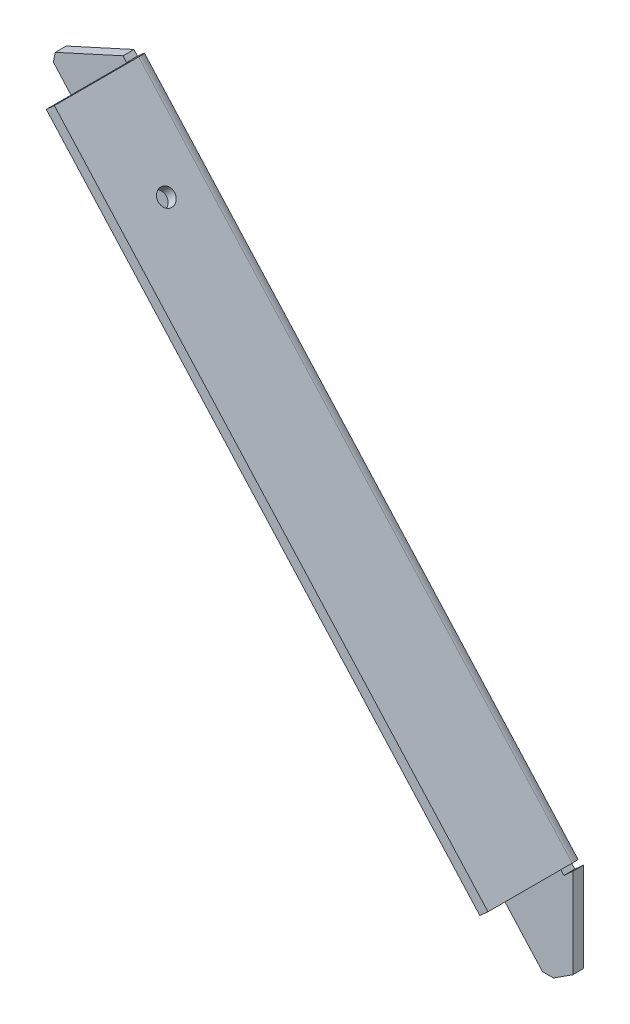
ISO-10303-21;
HEADER;
FILE_DESCRIPTION(('STEP AP214'),'2;1');
FILE_NAME('part.step','',(''),(''),'','','');
FILE_SCHEMA(('AUTOMOTIVE_DESIGN { 1 0 10303 214 1 1 1 1 }'));
ENDSEC;
DATA;
#1=APPLICATION_CONTEXT('core data for automotive mechanical design processes');
#2=APPLICATION_PROTOCOL_DEFINITION('international standard','automotive_design',2000,#1);
#3=PRODUCT_CONTEXT('',#1,'mechanical');
#4=PRODUCT('Part','Part','',(#3));
#5=PRODUCT_RELATED_PRODUCT_CATEGORY('part','',(#4));
#6=PRODUCT_DEFINITION_FORMATION('','',#4);
#7=PRODUCT_DEFINITION_CONTEXT('part definition',#1,'design');
#8=PRODUCT_DEFINITION('design','',#6,#7);
#9=PRODUCT_DEFINITION_SHAPE('','',#8);
#10=(LENGTH_UNIT() NAMED_UNIT(*) SI_UNIT(.MILLI.,.METRE.));
#11=(NAMED_UNIT(*) PLANE_ANGLE_UNIT() SI_UNIT($,.RADIAN.));
#12=(NAMED_UNIT(*) SI_UNIT($,.STERADIAN.) SOLID_ANGLE_UNIT());
#13=UNCERTAINTY_MEASURE_WITH_UNIT(LENGTH_MEASURE(1.E-05),#10,'distance_accuracy_value','');
#14=(GEOMETRIC_REPRESENTATION_CONTEXT(3) GLOBAL_UNCERTAINTY_ASSIGNED_CONTEXT((#13)) GLOBAL_UNIT_ASSIGNED_CONTEXT((#10,
#11,#12)) REPRESENTATION_CONTEXT('',''));
#15=CARTESIAN_POINT('',(0.,0.,0.));
#16=DIRECTION('',(0.,0.,1.));
#17=DIRECTION('',(1.,0.,0.));
#18=AXIS2_PLACEMENT_3D('',#15,#16,#17);
#19=CARTESIAN_POINT('',(0.,22.5,-4.));
#20=DIRECTION('',(1.,0.,0.));
#21=DIRECTION('',(0.,1.,0.));
#22=AXIS2_PLACEMENT_3D('',#19,#20,#21);
#23=PLANE('',#22);
#24=DIRECTION('',(0.,1.,0.));
#25=VECTOR('',#24,1.);
#26=CARTESIAN_POINT('',(0.,22.5,-4.));
#27=LINE('',#26,#25);
#28=CARTESIAN_POINT('',(0.,-12.9354413315967,-4.));
#29=VERTEX_POINT('',#28);
#30=CARTESIAN_POINT('',(0.,19.8083449613384,-4.));
#31=VERTEX_POINT('',#30);
#32=EDGE_CURVE('E167',#29,#31,#27,.T.);
#33=ORIENTED_EDGE('',*,*,#32,.T.);
#34=DIRECTION('',(0.,0.,-1.));
#35=VECTOR('',#34,1.);
#36=CARTESIAN_POINT('',(0.,19.8083449613383,0.));
#37=LINE('',#36,#35);
#38=CARTESIAN_POINT('',(0.,19.8083449613383,0.));
#39=VERTEX_POINT('',#38);
#40=EDGE_CURVE('E228',#39,#31,#37,.T.);
#41=ORIENTED_EDGE('',*,*,#40,.F.);
#42=DIRECTION('',(0.,1.,0.));
#43=VECTOR('',#42,1.);
#44=CARTESIAN_POINT('',(0.,22.5,0.));
#45=LINE('',#44,#43);
#46=CARTESIAN_POINT('',(0.,-12.9354413315967,0.));
#47=VERTEX_POINT('',#46);
#48=EDGE_CURVE('E152',#47,#39,#45,.T.);
#49=ORIENTED_EDGE('',*,*,#48,.F.);
#50=DIRECTION('',(0.,0.,1.));
#51=VECTOR('',#50,1.);
#52=CARTESIAN_POINT('',(0.,-12.9354413315967,-4.));
#53=LINE('',#52,#51);
#54=EDGE_CURVE('E65',#29,#47,#53,.T.);
#55=ORIENTED_EDGE('',*,*,#54,.F.);
#56=EDGE_LOOP('',(#33,#41,#49,#55));
#57=FACE_BOUND('',#56,.T.);
#58=ADVANCED_FACE('F57',(#57),#23,.T.);
#59=CARTESIAN_POINT('',(-158.455818562884,198.426141725651,-4.));
#60=DIRECTION('',(-0.41469324265625,0.909961270876538,0.));
#61=DIRECTION('',(-0.909961270876538,-0.41469324265625,0.));
#62=AXIS2_PLACEMENT_3D('',#59,#60,#61);
#63=PLANE('',#62);
#64=DIRECTION('',(-0.909961270876538,-0.41469324265625,0.));
#65=VECTOR('',#64,1.);
#66=CARTESIAN_POINT('',(-158.455818562884,198.426141725651,0.));
#67=LINE('',#66,#65);
#68=CARTESIAN_POINT('',(-164.371667995618,195.730133815376,0.));
#69=VERTEX_POINT('',#68);
#70=CARTESIAN_POINT('',(-189.121858967299,184.450821960136,0.));
#71=VERTEX_POINT('',#70);
#72=EDGE_CURVE('E155',#69,#71,#67,.T.);
#73=ORIENTED_EDGE('',*,*,#72,.F.);
#74=DIRECTION('',(0.,0.,-1.));
#75=VECTOR('',#74,1.);
#76=CARTESIAN_POINT('',(-164.371667995618,195.730133815376,-4.00000000000003));
#77=LINE('',#76,#75);
#78=CARTESIAN_POINT('',(-164.371667995618,195.730133815376,-4.));
#79=VERTEX_POINT('',#78);
#80=EDGE_CURVE('E156',#69,#79,#77,.T.);
#81=ORIENTED_EDGE('',*,*,#80,.T.);
#82=DIRECTION('',(-0.909961270876538,-0.41469324265625,0.));
#83=VECTOR('',#82,1.);
#84=CARTESIAN_POINT('',(-158.455818562884,198.426141725651,-4.));
#85=LINE('',#84,#83);
#86=CARTESIAN_POINT('',(-189.121858967299,184.450821960136,-4.));
#87=VERTEX_POINT('',#86);
#88=EDGE_CURVE('E111',#79,#87,#85,.T.);
#89=ORIENTED_EDGE('',*,*,#88,.T.);
#90=DIRECTION('',(0.,0.,1.));
#91=VECTOR('',#90,1.);
#92=CARTESIAN_POINT('',(-189.121858967299,184.450821960136,-4.));
#93=LINE('',#92,#91);
#94=EDGE_CURVE('E151',#87,#71,#93,.T.);
#95=ORIENTED_EDGE('',*,*,#94,.T.);
#96=EDGE_LOOP('',(#73,#81,#89,#95));
#97=FACE_BOUND('',#96,.T.);
#98=ADVANCED_FACE('F173',(#97),#63,.T.);
#99=CARTESIAN_POINT('',(0.,0.,-4.));
#100=DIRECTION('',(0.,0.,1.));
#101=DIRECTION('',(1.,0.,0.));
#102=AXIS2_PLACEMENT_3D('',#99,#100,#101);
#103=PLANE('',#102);
#104=DIRECTION('',(-0.66925004434474,0.743037265649956,0.));
#105=VECTOR('',#104,1.);
#106=CARTESIAN_POINT('',(6.5819177201558,5.92830121680986,-4.));
#107=LINE('',#106,#105);
#108=CARTESIAN_POINT('',(-163.062649609914,194.276791450713,-4.));
#109=VERTEX_POINT('',#108);
#110=EDGE_CURVE('E221',#109,#79,#107,.T.);
#111=ORIENTED_EDGE('',*,*,#110,.F.);
#112=DIRECTION('',(-0.743037265649956,-0.66925004434474,0.));
#113=VECTOR('',#112,1.);
#114=CARTESIAN_POINT('',(-169.64456733007,188.348490233904,-4.));
#115=LINE('',#114,#113);
#116=CARTESIAN_POINT('',(-161.576575078615,195.615291539402,-4.));
#117=VERTEX_POINT('',#116);
#118=EDGE_CURVE('E201',#117,#109,#115,.T.);
#119=ORIENTED_EDGE('',*,*,#118,.F.);
#120=DIRECTION('',(-0.669250044344741,0.743037265649956,0.));
#121=VECTOR('',#120,1.);
#122=CARTESIAN_POINT('',(-161.576575078615,195.615291539402,-4.));
#123=LINE('',#122,#121);
#124=CARTESIAN_POINT('',(-3.12075651572979,19.689149813752,-4.));
#125=VERTEX_POINT('',#124);
#126=EDGE_CURVE('E259',#117,#125,#123,.F.);
#127=ORIENTED_EDGE('',*,*,#126,.T.);
#128=DIRECTION('',(0.743037265649955,0.669250044344741,0.));
#129=VECTOR('',#128,1.);
#130=CARTESIAN_POINT('',(-11.1887487671856,12.4223485082526,-4.));
#131=LINE('',#130,#129);
#132=CARTESIAN_POINT('',(-4.60683104702971,18.3506497250625,-4.));
#133=VERTEX_POINT('',#132);
#134=EDGE_CURVE('E217',#133,#125,#131,.T.);
#135=ORIENTED_EDGE('',*,*,#134,.F.);
#136=DIRECTION('',(-0.669250044344741,0.743037265649955,0.));
#137=VECTOR('',#136,1.);
#138=CARTESIAN_POINT('',(6.58191772015588,5.92830121680994,-4.));
#139=LINE('',#138,#137);
#140=CARTESIAN_POINT('',(-3.26833095834022,16.8645751937626,-4.));
#141=VERTEX_POINT('',#140);
#142=EDGE_CURVE('E214',#141,#133,#139,.T.);
#143=ORIENTED_EDGE('',*,*,#142,.F.);
#144=DIRECTION('',(-0.743037265649955,-0.669250044344741,0.));
#145=VECTOR('',#144,1.);
#146=CARTESIAN_POINT('',(-9.8502486784961,10.9362739769527,-4.));
#147=LINE('',#146,#145);
#148=EDGE_CURVE('E204',#31,#141,#147,.T.);
#149=ORIENTED_EDGE('',*,*,#148,.F.);
#150=ORIENTED_EDGE('',*,*,#32,.F.);
#151=DIRECTION('',(0.840334765302903,0.542067783790289,0.));
#152=VECTOR('',#151,1.);
#153=CARTESIAN_POINT('',(0.,-12.9354413315967,-4.));
#154=LINE('',#153,#152);
#155=CARTESIAN_POINT('',(-7.07615809687734,-17.5,-4.));
#156=VERTEX_POINT('',#155);
#157=EDGE_CURVE('E142',#156,#29,#154,.T.);
#158=ORIENTED_EDGE('',*,*,#157,.F.);
#159=DIRECTION('',(1.,0.,0.));
#160=VECTOR('',#159,1.);
#161=CARTESIAN_POINT('',(-11.0761580968773,-17.5,-4.));
#162=LINE('',#161,#160);
#163=CARTESIAN_POINT('',(-11.0761580968773,-17.5,-4.));
#164=VERTEX_POINT('',#163);
#165=EDGE_CURVE('E124',#164,#156,#162,.T.);
#166=ORIENTED_EDGE('',*,*,#165,.F.);
#167=DIRECTION('',(0.669250044344741,-0.743037265649956,0.));
#168=VECTOR('',#167,1.);
#169=CARTESIAN_POINT('',(-11.0761580968773,-17.5,-4.));
#170=LINE('',#169,#168);
#171=CARTESIAN_POINT('',(-189.843992646894,180.977630435217,-4.));
#172=VERTEX_POINT('',#171);
#173=EDGE_CURVE('E140',#172,#164,#170,.T.);
#174=ORIENTED_EDGE('',*,*,#173,.F.);
#175=DIRECTION('',(-0.203563068859588,-0.979061835124047,0.));
#176=VECTOR('',#175,1.);
#177=CARTESIAN_POINT('',(-189.843992646894,180.977630435217,-4.));
#178=LINE('',#177,#176);
#179=EDGE_CURVE('E145',#87,#172,#178,.T.);
#180=ORIENTED_EDGE('',*,*,#179,.F.);
#181=ORIENTED_EDGE('',*,*,#88,.F.);
#182=EDGE_LOOP('',(#111,#119,#127,#135,#143,#149,#150,#158,#166,#174,#180,#181));
#183=FACE_BOUND('',#182,.T.);
#184=ADVANCED_FACE('F138',(#183),#103,.F.);
#185=CARTESIAN_POINT('',(0.,0.,0.));
#186=DIRECTION('',(0.,0.,1.));
#187=DIRECTION('',(1.,0.,0.));
#188=AXIS2_PLACEMENT_3D('',#185,#186,#187);
#189=PLANE('',#188);
#190=DIRECTION('',(0.743037265649956,0.669250044344741,0.));
#191=VECTOR('',#190,1.);
#192=CARTESIAN_POINT('',(-163.062649609914,194.276791450713,0.));
#193=LINE('',#192,#191);
#194=CARTESIAN_POINT('',(-163.062649609914,194.276791450713,0.));
#195=VERTEX_POINT('',#194);
#196=CARTESIAN_POINT('',(-161.576575078614,195.615291539403,0.));
#197=VERTEX_POINT('',#196);
#198=EDGE_CURVE('E184',#195,#197,#193,.T.);
#199=ORIENTED_EDGE('',*,*,#198,.F.);
#200=DIRECTION('',(-0.66925004434474,0.743037265649956,0.));
#201=VECTOR('',#200,1.);
#202=CARTESIAN_POINT('',(6.58191772015579,5.92830121680984,0.));
#203=LINE('',#202,#201);
#204=EDGE_CURVE('E13',#195,#69,#203,.T.);
#205=ORIENTED_EDGE('',*,*,#204,.T.);
#206=ORIENTED_EDGE('',*,*,#72,.T.);
#207=DIRECTION('',(-0.203563068859588,-0.979061835124047,0.));
#208=VECTOR('',#207,1.);
#209=CARTESIAN_POINT('',(-189.843992646894,180.977630435217,0.));
#210=LINE('',#209,#208);
#211=CARTESIAN_POINT('',(-189.843992646894,180.977630435217,0.));
#212=VERTEX_POINT('',#211);
#213=EDGE_CURVE('E158',#71,#212,#210,.T.);
#214=ORIENTED_EDGE('',*,*,#213,.T.);
#215=DIRECTION('',(0.669250044344741,-0.743037265649956,0.));
#216=VECTOR('',#215,1.);
#217=CARTESIAN_POINT('',(-11.0761580968773,-17.5,0.));
#218=LINE('',#217,#216);
#219=CARTESIAN_POINT('',(-11.0761580968773,-17.5,0.));
#220=VERTEX_POINT('',#219);
#221=EDGE_CURVE('E161',#212,#220,#218,.T.);
#222=ORIENTED_EDGE('',*,*,#221,.T.);
#223=DIRECTION('',(1.,0.,0.));
#224=VECTOR('',#223,1.);
#225=CARTESIAN_POINT('',(-11.0761580968773,-17.5,0.));
#226=LINE('',#225,#224);
#227=CARTESIAN_POINT('',(-7.07615809687734,-17.5,0.));
#228=VERTEX_POINT('',#227);
#229=EDGE_CURVE('E127',#220,#228,#226,.T.);
#230=ORIENTED_EDGE('',*,*,#229,.T.);
#231=DIRECTION('',(0.840334765302903,0.542067783790289,0.));
#232=VECTOR('',#231,1.);
#233=CARTESIAN_POINT('',(0.,-12.9354413315967,0.));
#234=LINE('',#233,#232);
#235=EDGE_CURVE('E164',#228,#47,#234,.T.);
#236=ORIENTED_EDGE('',*,*,#235,.T.);
#237=ORIENTED_EDGE('',*,*,#48,.T.);
#238=DIRECTION('',(0.743037265649955,0.669250044344741,0.));
#239=VECTOR('',#238,1.);
#240=CARTESIAN_POINT('',(-3.26833095834022,16.8645751937626,0.));
#241=LINE('',#240,#239);
#242=CARTESIAN_POINT('',(-3.26833095834022,16.8645751937626,0.));
#243=VERTEX_POINT('',#242);
#244=EDGE_CURVE('E237',#243,#39,#241,.T.);
#245=ORIENTED_EDGE('',*,*,#244,.F.);
#246=DIRECTION('',(0.669250044344741,-0.743037265649955,0.));
#247=VECTOR('',#246,1.);
#248=CARTESIAN_POINT('',(-4.60683104702971,18.3506497250625,0.));
#249=LINE('',#248,#247);
#250=CARTESIAN_POINT('',(-4.60683104702971,18.3506497250625,0.));
#251=VERTEX_POINT('',#250);
#252=EDGE_CURVE('E72',#251,#243,#249,.T.);
#253=ORIENTED_EDGE('',*,*,#252,.F.);
#254=DIRECTION('',(-0.743037265649955,-0.669250044344741,0.));
#255=VECTOR('',#254,1.);
#256=CARTESIAN_POINT('',(-3.12075651572979,19.689149813752,0.));
#257=LINE('',#256,#255);
#258=CARTESIAN_POINT('',(-3.12075651572979,19.689149813752,0.));
#259=VERTEX_POINT('',#258);
#260=EDGE_CURVE('E202',#259,#251,#257,.T.);
#261=ORIENTED_EDGE('',*,*,#260,.F.);
#262=DIRECTION('',(-0.669250044344741,0.743037265649956,0.));
#263=VECTOR('',#262,1.);
#264=CARTESIAN_POINT('',(-161.576575078614,195.615291539403,0.));
#265=LINE('',#264,#263);
#266=EDGE_CURVE('E289',#197,#259,#265,.F.);
#267=ORIENTED_EDGE('',*,*,#266,.F.);
#268=EDGE_LOOP('',(#199,#205,#206,#214,#222,#230,#236,#237,#245,#253,#261,#267));
#269=FACE_BOUND('',#268,.T.);
#270=ADVANCED_FACE('F179',(#269),#189,.T.);
#271=CARTESIAN_POINT('',(0.,-12.9354413315967,-4.));
#272=DIRECTION('',(0.542067783790289,-0.840334765302903,0.));
#273=DIRECTION('',(0.840334765302903,0.542067783790289,0.));
#274=AXIS2_PLACEMENT_3D('',#271,#272,#273);
#275=PLANE('',#274);
#276=ORIENTED_EDGE('',*,*,#235,.F.);
#277=DIRECTION('',(0.,0.,1.));
#278=VECTOR('',#277,1.);
#279=CARTESIAN_POINT('',(-7.07615809687734,-17.5,-4.));
#280=LINE('',#279,#278);
#281=EDGE_CURVE('E132',#156,#228,#280,.T.);
#282=ORIENTED_EDGE('',*,*,#281,.F.);
#283=ORIENTED_EDGE('',*,*,#157,.T.);
#284=ORIENTED_EDGE('',*,*,#54,.T.);
#285=EDGE_LOOP('',(#276,#282,#283,#284));
#286=FACE_BOUND('',#285,.T.);
#287=ADVANCED_FACE('F234',(#286),#275,.T.);
#288=CARTESIAN_POINT('',(-11.0761580968773,-17.5,-4.));
#289=DIRECTION('',(0.,-1.,0.));
#290=DIRECTION('',(1.,0.,0.));
#291=AXIS2_PLACEMENT_3D('',#288,#289,#290);
#292=PLANE('',#291);
#293=ORIENTED_EDGE('',*,*,#229,.F.);
#294=DIRECTION('',(0.,0.,1.));
#295=VECTOR('',#294,1.);
#296=CARTESIAN_POINT('',(-11.0761580968773,-17.5,-4.));
#297=LINE('',#296,#295);
#298=EDGE_CURVE('E121',#164,#220,#297,.T.);
#299=ORIENTED_EDGE('',*,*,#298,.F.);
#300=ORIENTED_EDGE('',*,*,#165,.T.);
#301=ORIENTED_EDGE('',*,*,#281,.T.);
#302=EDGE_LOOP('',(#293,#299,#300,#301));
#303=FACE_BOUND('',#302,.T.);
#304=ADVANCED_FACE('F123',(#303),#292,.T.);
#305=CARTESIAN_POINT('',(-11.0761580968773,-17.5,-4.));
#306=DIRECTION('',(-0.743037265649955,-0.669250044344741,0.));
#307=DIRECTION('',(0.669250044344741,-0.743037265649955,0.));
#308=AXIS2_PLACEMENT_3D('',#305,#306,#307);
#309=PLANE('',#308);
#310=ORIENTED_EDGE('',*,*,#221,.F.);
#311=DIRECTION('',(0.,0.,1.));
#312=VECTOR('',#311,1.);
#313=CARTESIAN_POINT('',(-189.843992646894,180.977630435217,-4.));
#314=LINE('',#313,#312);
#315=EDGE_CURVE('E133',#172,#212,#314,.T.);
#316=ORIENTED_EDGE('',*,*,#315,.F.);
#317=ORIENTED_EDGE('',*,*,#173,.T.);
#318=ORIENTED_EDGE('',*,*,#298,.T.);
#319=EDGE_LOOP('',(#310,#316,#317,#318));
#320=FACE_BOUND('',#319,.T.);
#321=ADVANCED_FACE('F144',(#320),#309,.T.);
#322=CARTESIAN_POINT('',(-189.843992646894,180.977630435217,-4.));
#323=DIRECTION('',(-0.979061835124047,0.203563068859588,0.));
#324=DIRECTION('',(-0.203563068859588,-0.979061835124047,0.));
#325=AXIS2_PLACEMENT_3D('',#322,#323,#324);
#326=PLANE('',#325);
#327=ORIENTED_EDGE('',*,*,#213,.F.);
#328=ORIENTED_EDGE('',*,*,#94,.F.);
#329=ORIENTED_EDGE('',*,*,#179,.T.);
#330=ORIENTED_EDGE('',*,*,#315,.T.);
#331=EDGE_LOOP('',(#327,#328,#329,#330));
#332=FACE_BOUND('',#331,.T.);
#333=ADVANCED_FACE('F176',(#332),#326,.T.);
#334=CARTESIAN_POINT('',(-163.062649609914,194.276791450713,0.));
#335=DIRECTION('',(-0.66925004434474,0.743037265649956,0.));
#336=DIRECTION('',(-0.743037265649956,-0.66925004434474,0.));
#337=AXIS2_PLACEMENT_3D('',#334,#335,#336);
#338=PLANE('',#337);
#339=DIRECTION('',(-1.38055375599973E-13,-1.24279279507674E-13,-1.));
#340=VECTOR('',#339,1.);
#341=CARTESIAN_POINT('',(-161.576575078614,195.615291539403,0.));
#342=LINE('',#341,#340);
#343=EDGE_CURVE('E277',#197,#117,#342,.T.);
#344=ORIENTED_EDGE('',*,*,#343,.T.);
#345=ORIENTED_EDGE('',*,*,#118,.T.);
#346=DIRECTION('',(0.,0.,-1.));
#347=VECTOR('',#346,1.);
#348=CARTESIAN_POINT('',(-163.062649609914,194.276791450713,0.));
#349=LINE('',#348,#347);
#350=EDGE_CURVE('E192',#195,#109,#349,.T.);
#351=ORIENTED_EDGE('',*,*,#350,.F.);
#352=ORIENTED_EDGE('',*,*,#198,.T.);
#353=EDGE_LOOP('',(#344,#345,#351,#352));
#354=FACE_BOUND('',#353,.T.);
#355=ADVANCED_FACE('F199',(#354),#338,.T.);
#356=CARTESIAN_POINT('',(-3.12075651572979,19.689149813752,0.));
#357=DIRECTION('',(0.669250044344741,-0.743037265649955,0.));
#358=DIRECTION('',(0.743037265649955,0.669250044344741,0.));
#359=AXIS2_PLACEMENT_3D('',#356,#357,#358);
#360=PLANE('',#359);
#361=DIRECTION('',(0.,0.,-1.));
#362=VECTOR('',#361,1.);
#363=CARTESIAN_POINT('',(-4.60683104702971,18.3506497250625,0.));
#364=LINE('',#363,#362);
#365=EDGE_CURVE('E210',#251,#133,#364,.T.);
#366=ORIENTED_EDGE('',*,*,#365,.T.);
#367=ORIENTED_EDGE('',*,*,#134,.T.);
#368=DIRECTION('',(-2.77555756156274E-13,0.,-1.));
#369=VECTOR('',#368,1.);
#370=CARTESIAN_POINT('',(-3.12075651572979,19.689149813752,0.));
#371=LINE('',#370,#369);
#372=EDGE_CURVE('E256',#259,#125,#371,.T.);
#373=ORIENTED_EDGE('',*,*,#372,.F.);
#374=ORIENTED_EDGE('',*,*,#260,.T.);
#375=EDGE_LOOP('',(#366,#367,#373,#374));
#376=FACE_BOUND('',#375,.T.);
#377=ADVANCED_FACE('F254',(#376),#360,.T.);
#378=CARTESIAN_POINT('',(-4.60683104702971,18.3506497250625,0.));
#379=DIRECTION('',(0.743037265649955,0.669250044344741,0.));
#380=DIRECTION('',(-0.669250044344741,0.743037265649955,0.));
#381=AXIS2_PLACEMENT_3D('',#378,#379,#380);
#382=PLANE('',#381);
#383=DIRECTION('',(0.,0.,-1.));
#384=VECTOR('',#383,1.);
#385=CARTESIAN_POINT('',(-3.26833095834022,16.8645751937626,0.));
#386=LINE('',#385,#384);
#387=EDGE_CURVE('E276',#243,#141,#386,.T.);
#388=ORIENTED_EDGE('',*,*,#387,.T.);
#389=ORIENTED_EDGE('',*,*,#142,.T.);
#390=ORIENTED_EDGE('',*,*,#365,.F.);
#391=ORIENTED_EDGE('',*,*,#252,.T.);
#392=EDGE_LOOP('',(#388,#389,#390,#391));
#393=FACE_BOUND('',#392,.T.);
#394=ADVANCED_FACE('F298',(#393),#382,.T.);
#395=CARTESIAN_POINT('',(-3.26833095834022,16.8645751937626,0.));
#396=DIRECTION('',(-0.669250044344741,0.743037265649955,0.));
#397=DIRECTION('',(-0.743037265649955,-0.669250044344741,0.));
#398=AXIS2_PLACEMENT_3D('',#395,#396,#397);
#399=PLANE('',#398);
#400=ORIENTED_EDGE('',*,*,#40,.T.);
#401=ORIENTED_EDGE('',*,*,#148,.T.);
#402=ORIENTED_EDGE('',*,*,#387,.F.);
#403=ORIENTED_EDGE('',*,*,#244,.T.);
#404=EDGE_LOOP('',(#400,#401,#402,#403));
#405=FACE_BOUND('',#404,.T.);
#406=ADVANCED_FACE('F299',(#405),#399,.T.);
#407=CARTESIAN_POINT('',(-164.401149698603,195.762865982013,0.));
#408=DIRECTION('',(0.743037265649956,0.66925004434474,0.));
#409=DIRECTION('',(-0.66925004434474,0.743037265649956,0.));
#410=AXIS2_PLACEMENT_3D('',#407,#408,#409);
#411=PLANE('',#410);
#412=ORIENTED_EDGE('',*,*,#80,.F.);
#413=ORIENTED_EDGE('',*,*,#204,.F.);
#414=ORIENTED_EDGE('',*,*,#350,.T.);
#415=ORIENTED_EDGE('',*,*,#110,.T.);
#416=EDGE_LOOP('',(#412,#413,#414,#415));
#417=FACE_BOUND('',#416,.T.);
#418=ADVANCED_FACE('F190',(#417),#411,.T.);
#419=CARTESIAN_POINT('',(-3.12075651572977,19.6891498137521,0.200000000000003));
#420=DIRECTION('',(0.669250044344741,-0.743037265649956,0.));
#421=DIRECTION('',(0.743037265649956,0.669250044344741,0.));
#422=AXIS2_PLACEMENT_3D('',#419,#420,#421);
#423=PLANE('',#422);
#424=DIRECTION('',(-0.743037265649955,-0.669250044344741,0.));
#425=VECTOR('',#424,1.);
#426=CARTESIAN_POINT('',(0.,22.5,0.199999999999988));
#427=LINE('',#426,#425);
#428=CARTESIAN_POINT('',(-2.97214906259977,19.822999822621,0.200000000000002));
#429=VERTEX_POINT('',#428);
#430=CARTESIAN_POINT('',(0.,22.5,0.199999999999988));
#431=VERTEX_POINT('',#430);
#432=EDGE_CURVE('E551',#429,#431,#427,.F.);
#433=ORIENTED_EDGE('',*,*,#432,.F.);
#434=CARTESIAN_POINT('',(-3.12075651572977,19.6891498137521,0.200000000000003));
#435=DIRECTION('',(-0.669250044344741,0.743037265649956,0.));
#436=DIRECTION('',(-0.743037265649956,-0.669250044344741,0.));
#437=AXIS2_PLACEMENT_3D('',#434,#435,#436);
#438=CIRCLE('',#437,0.200000000000011);
#439=EDGE_CURVE('E275',#259,#429,#438,.F.);
#440=ORIENTED_EDGE('',*,*,#439,.F.);
#441=ORIENTED_EDGE('',*,*,#372,.T.);
#442=CARTESIAN_POINT('',(-3.12075651572974,19.689149813752,0.200000000000003));
#443=DIRECTION('',(-0.669250044344741,0.743037265649956,0.));
#444=DIRECTION('',(-0.743037265649956,-0.669250044344741,0.));
#445=AXIS2_PLACEMENT_3D('',#442,#443,#444);
#446=CIRCLE('',#445,4.20000000000001);
#447=EDGE_CURVE('E264',#125,#431,#446,.F.);
#448=ORIENTED_EDGE('',*,*,#447,.T.);
#449=EDGE_LOOP('',(#433,#440,#441,#448));
#450=FACE_BOUND('',#449,.T.);
#451=ADVANCED_FACE('F271',(#450),#423,.T.);
#452=CARTESIAN_POINT('',(-161.576575078614,195.615291539403,0.200000000000015));
#453=DIRECTION('',(0.669250044344741,-0.743037265649956,0.));
#454=DIRECTION('',(0.743037265649956,0.669250044344741,0.));
#455=AXIS2_PLACEMENT_3D('',#452,#453,#454);
#456=PLANE('',#455);
#457=CARTESIAN_POINT('',(-161.576575078614,195.615291539403,0.200000000000015));
#458=DIRECTION('',(-0.669250044344741,0.743037265649956,0.));
#459=DIRECTION('',(-0.743037265649956,-0.669250044344741,0.));
#460=AXIS2_PLACEMENT_3D('',#457,#458,#459);
#461=CIRCLE('',#460,0.200000000000011);
#462=CARTESIAN_POINT('',(-161.427967625484,195.749141548272,0.200000000000014));
#463=VERTEX_POINT('',#462);
#464=EDGE_CURVE('E292',#463,#197,#461,.T.);
#465=ORIENTED_EDGE('',*,*,#464,.F.);
#466=DIRECTION('',(-0.743037265649955,-0.669250044344741,0.));
#467=VECTOR('',#466,1.);
#468=CARTESIAN_POINT('',(-161.427967625484,195.749141548272,0.200000000000014));
#469=LINE('',#468,#467);
#470=CARTESIAN_POINT('',(-158.455818562884,198.426141725651,0.2));
#471=VERTEX_POINT('',#470);
#472=EDGE_CURVE('E577',#463,#471,#469,.F.);
#473=ORIENTED_EDGE('',*,*,#472,.T.);
#474=CARTESIAN_POINT('',(-161.576575078614,195.615291539403,0.200000000000015));
#475=DIRECTION('',(-0.669250044344741,0.743037265649956,0.));
#476=DIRECTION('',(-0.743037265649956,-0.669250044344741,0.));
#477=AXIS2_PLACEMENT_3D('',#474,#475,#476);
#478=CIRCLE('',#477,4.20000000000001);
#479=EDGE_CURVE('E265',#471,#117,#478,.T.);
#480=ORIENTED_EDGE('',*,*,#479,.T.);
#481=ORIENTED_EDGE('',*,*,#343,.F.);
#482=EDGE_LOOP('',(#465,#473,#480,#481));
#483=FACE_BOUND('',#482,.T.);
#484=ADVANCED_FACE('F361',(#483),#456,.F.);
#485=CARTESIAN_POINT('',(-161.576575078614,195.615291539403,0.200000000000015));
#486=DIRECTION('',(-0.669250044344741,0.743037265649956,0.));
#487=DIRECTION('',(0.743037265649956,0.669250044344741,0.));
#488=AXIS2_PLACEMENT_3D('',#485,#486,#487);
#489=CYLINDRICAL_SURFACE('',#488,4.20000000000001);
#490=ORIENTED_EDGE('',*,*,#126,.F.);
#491=ORIENTED_EDGE('',*,*,#479,.F.);
#492=DIRECTION('',(-0.669250044344741,0.743037265649955,0.));
#493=VECTOR('',#492,1.);
#494=CARTESIAN_POINT('',(0.,22.5,0.199999999999988));
#495=LINE('',#494,#493);
#496=EDGE_CURVE('E282',#471,#431,#495,.F.);
#497=ORIENTED_EDGE('',*,*,#496,.T.);
#498=ORIENTED_EDGE('',*,*,#447,.F.);
#499=EDGE_LOOP('',(#490,#491,#497,#498));
#500=FACE_BOUND('',#499,.T.);
#501=ADVANCED_FACE('F280',(#500),#489,.T.);
#502=CARTESIAN_POINT('',(-161.576575078614,195.615291539403,0.200000000000015));
#503=DIRECTION('',(-0.669250044344741,0.743037265649956,0.));
#504=DIRECTION('',(0.743037265649956,0.669250044344741,0.));
#505=AXIS2_PLACEMENT_3D('',#502,#503,#504);
#506=CYLINDRICAL_SURFACE('',#505,0.200000000000011);
#507=ORIENTED_EDGE('',*,*,#266,.T.);
#508=ORIENTED_EDGE('',*,*,#439,.T.);
#509=DIRECTION('',(-0.669250044344741,0.743037265649955,0.));
#510=VECTOR('',#509,1.);
#511=CARTESIAN_POINT('',(-2.97214906259982,19.822999822621,0.200000000000002));
#512=LINE('',#511,#510);
#513=EDGE_CURVE('E580',#429,#463,#512,.T.);
#514=ORIENTED_EDGE('',*,*,#513,.T.);
#515=ORIENTED_EDGE('',*,*,#464,.T.);
#516=EDGE_LOOP('',(#507,#508,#514,#515));
#517=FACE_BOUND('',#516,.T.);
#518=ADVANCED_FACE('F380',(#517),#506,.F.);
#519=CARTESIAN_POINT('',(0.,22.5,0.));
#520=DIRECTION('',(-0.669250044344741,0.743037265649955,0.));
#521=DIRECTION('',(-0.743037265649955,-0.669250044344741,0.));
#522=AXIS2_PLACEMENT_3D('',#519,#520,#521);
#523=PLANE('',#522);
#524=ORIENTED_EDGE('',*,*,#432,.T.);
#525=DIRECTION('',(0.,0.,-1.));
#526=VECTOR('',#525,1.);
#527=CARTESIAN_POINT('',(0.,22.5,0.));
#528=LINE('',#527,#526);
#529=CARTESIAN_POINT('',(0.,22.5000000000001,31.));
#530=VERTEX_POINT('',#529);
#531=EDGE_CURVE('E564',#530,#431,#528,.T.);
#532=ORIENTED_EDGE('',*,*,#531,.F.);
#533=DIRECTION('',(-0.743037265649955,-0.669250044344741,0.));
#534=VECTOR('',#533,1.);
#535=CARTESIAN_POINT('',(0.,22.5000000000001,31.));
#536=LINE('',#535,#534);
#537=CARTESIAN_POINT('',(-2.97214906259974,19.8229998226211,31.));
#538=VERTEX_POINT('',#537);
#539=EDGE_CURVE('E555',#530,#538,#536,.T.);
#540=ORIENTED_EDGE('',*,*,#539,.T.);
#541=DIRECTION('',(0.,0.,1.));
#542=VECTOR('',#541,1.);
#543=CARTESIAN_POINT('',(-2.97214906259982,19.822999822621,0.));
#544=LINE('',#543,#542);
#545=EDGE_CURVE('E573',#538,#429,#544,.F.);
#546=ORIENTED_EDGE('',*,*,#545,.T.);
#547=EDGE_LOOP('',(#524,#532,#540,#546));
#548=FACE_BOUND('',#547,.T.);
#549=ADVANCED_FACE('F390',(#548),#523,.F.);
#550=CARTESIAN_POINT('',(-158.455818562884,198.426141725651,31.));
#551=DIRECTION('',(0.669250044344741,-0.743037265649955,0.));
#552=DIRECTION('',(0.743037265649955,0.669250044344741,0.));
#553=AXIS2_PLACEMENT_3D('',#550,#551,#552);
#554=PLANE('',#553);
#555=ORIENTED_EDGE('',*,*,#472,.F.);
#556=DIRECTION('',(0.,0.,-1.));
#557=VECTOR('',#556,1.);
#558=CARTESIAN_POINT('',(-161.427967625484,195.749141548272,31.));
#559=LINE('',#558,#557);
#560=CARTESIAN_POINT('',(-161.427967625484,195.749141548272,31.));
#561=VERTEX_POINT('',#560);
#562=EDGE_CURVE('E570',#463,#561,#559,.F.);
#563=ORIENTED_EDGE('',*,*,#562,.T.);
#564=DIRECTION('',(-0.743037265649955,-0.669250044344741,0.));
#565=VECTOR('',#564,1.);
#566=CARTESIAN_POINT('',(-158.455818562884,198.426141725651,31.));
#567=LINE('',#566,#565);
#568=CARTESIAN_POINT('',(-158.455818562884,198.426141725651,31.));
#569=VERTEX_POINT('',#568);
#570=EDGE_CURVE('E294',#569,#561,#567,.T.);
#571=ORIENTED_EDGE('',*,*,#570,.F.);
#572=DIRECTION('',(0.,0.,1.));
#573=VECTOR('',#572,1.);
#574=CARTESIAN_POINT('',(-158.455818562884,198.426141725651,-7.58871029037363E-13));
#575=LINE('',#574,#573);
#576=EDGE_CURVE('E561',#471,#569,#575,.T.);
#577=ORIENTED_EDGE('',*,*,#576,.F.);
#578=EDGE_LOOP('',(#555,#563,#571,#577));
#579=FACE_BOUND('',#578,.T.);
#580=ADVANCED_FACE('F401',(#579),#554,.F.);
#581=CARTESIAN_POINT('',(11.1887487671856,10.0776514917473,0.));
#582=DIRECTION('',(-0.743037265649955,-0.669250044344741,0.));
#583=DIRECTION('',(0.669250044344741,-0.743037265649955,0.));
#584=AXIS2_PLACEMENT_3D('',#581,#582,#583);
#585=PLANE('',#584);
#586=CARTESIAN_POINT('',(-135.032067010818,172.419837427902,13.5));
#587=DIRECTION('',(0.743037265649955,0.669250044344741,0.));
#588=DIRECTION('',(-0.669250044344741,0.743037265649955,0.));
#589=AXIS2_PLACEMENT_3D('',#586,#587,#588);
#590=CIRCLE('',#589,3.);
#591=CARTESIAN_POINT('',(-137.039817143853,174.648949224852,13.5));
#592=VERTEX_POINT('',#591);
#593=EDGE_CURVE('E549',#592,#592,#590,.T.);
#594=ORIENTED_EDGE('',*,*,#593,.F.);
#595=EDGE_LOOP('',(#594));
#596=FACE_BOUND('',#595,.T.);
#597=ORIENTED_EDGE('',*,*,#496,.F.);
#598=ORIENTED_EDGE('',*,*,#576,.T.);
#599=DIRECTION('',(0.669250044344741,-0.743037265649955,0.));
#600=VECTOR('',#599,1.);
#601=CARTESIAN_POINT('',(11.1887487671857,10.0776514917474,31.));
#602=LINE('',#601,#600);
#603=EDGE_CURVE('E558',#569,#530,#602,.T.);
#604=ORIENTED_EDGE('',*,*,#603,.T.);
#605=ORIENTED_EDGE('',*,*,#531,.T.);
#606=EDGE_LOOP('',(#597,#598,#604,#605));
#607=FACE_BOUND('',#606,.T.);
#608=ADVANCED_FACE('F412',(#596,#607),#585,.F.);
#609=CARTESIAN_POINT('',(8.2165997045858,7.40065131436838,0.));
#610=DIRECTION('',(-0.743037265649955,-0.669250044344741,0.));
#611=DIRECTION('',(0.669250044344741,-0.743037265649955,0.));
#612=AXIS2_PLACEMENT_3D('',#609,#610,#611);
#613=PLANE('',#612);
#614=CARTESIAN_POINT('',(-138.004216073418,169.742837250523,13.5));
#615=DIRECTION('',(-0.743037265649955,-0.669250044344741,0.));
#616=DIRECTION('',(0.669250044344741,-0.743037265649955,0.));
#617=AXIS2_PLACEMENT_3D('',#614,#615,#616);
#618=CIRCLE('',#617,3.);
#619=CARTESIAN_POINT('',(-135.996465940384,167.513725453574,13.5));
#620=VERTEX_POINT('',#619);
#621=EDGE_CURVE('E60',#620,#620,#618,.T.);
#622=ORIENTED_EDGE('',*,*,#621,.F.);
#623=EDGE_LOOP('',(#622));
#624=FACE_BOUND('',#623,.T.);
#625=ORIENTED_EDGE('',*,*,#562,.F.);
#626=ORIENTED_EDGE('',*,*,#513,.F.);
#627=ORIENTED_EDGE('',*,*,#545,.F.);
#628=DIRECTION('',(-0.669250044344741,0.743037265649955,0.));
#629=VECTOR('',#628,1.);
#630=CARTESIAN_POINT('',(-2.97214906259974,19.8229998226211,31.));
#631=LINE('',#630,#629);
#632=EDGE_CURVE('E567',#561,#538,#631,.F.);
#633=ORIENTED_EDGE('',*,*,#632,.F.);
#634=EDGE_LOOP('',(#625,#626,#627,#633));
#635=FACE_BOUND('',#634,.T.);
#636=ADVANCED_FACE('F427',(#624,#635),#613,.T.);
#637=CARTESIAN_POINT('',(0.,22.5000000000001,31.));
#638=DIRECTION('',(0.,0.,-1.));
#639=DIRECTION('',(-1.,0.,0.));
#640=AXIS2_PLACEMENT_3D('',#637,#638,#639);
#641=PLANE('',#640);
#642=ORIENTED_EDGE('',*,*,#632,.T.);
#643=ORIENTED_EDGE('',*,*,#539,.F.);
#644=ORIENTED_EDGE('',*,*,#603,.F.);
#645=ORIENTED_EDGE('',*,*,#570,.T.);
#646=EDGE_LOOP('',(#642,#643,#644,#645));
#647=FACE_BOUND('',#646,.T.);
#648=ADVANCED_FACE('F421',(#647),#641,.F.);
#649=CARTESIAN_POINT('',(-142.462439667318,165.727336984455,13.5));
#650=DIRECTION('',(0.743037265649955,0.669250044344741,0.));
#651=DIRECTION('',(-0.669250044344741,0.743037265649955,0.));
#652=AXIS2_PLACEMENT_3D('',#649,#650,#651);
#653=CYLINDRICAL_SURFACE('',#652,3.);
#654=ORIENTED_EDGE('',*,*,#621,.T.);
#655=EDGE_LOOP('',(#654));
#656=FACE_BOUND('',#655,.T.);
#657=ORIENTED_EDGE('',*,*,#593,.T.);
#658=EDGE_LOOP('',(#657));
#659=FACE_BOUND('',#658,.T.);
#660=ADVANCED_FACE('F426',(#656,#659),#653,.F.);
#661=CLOSED_SHELL('',(#58,#98,#184,#270,#287,#304,#321,#333,#355,#377,#394,#406,#418,#451,#484,
#501,#518,#549,#580,#608,#636,#648,#660));
#662=MANIFOLD_SOLID_BREP('B2',#661);
#663=ADVANCED_BREP_SHAPE_REPRESENTATION('',(#18,#662),#14);
#664=SHAPE_DEFINITION_REPRESENTATION(#9,#663);
ENDSEC;
END-ISO-10303-21;
